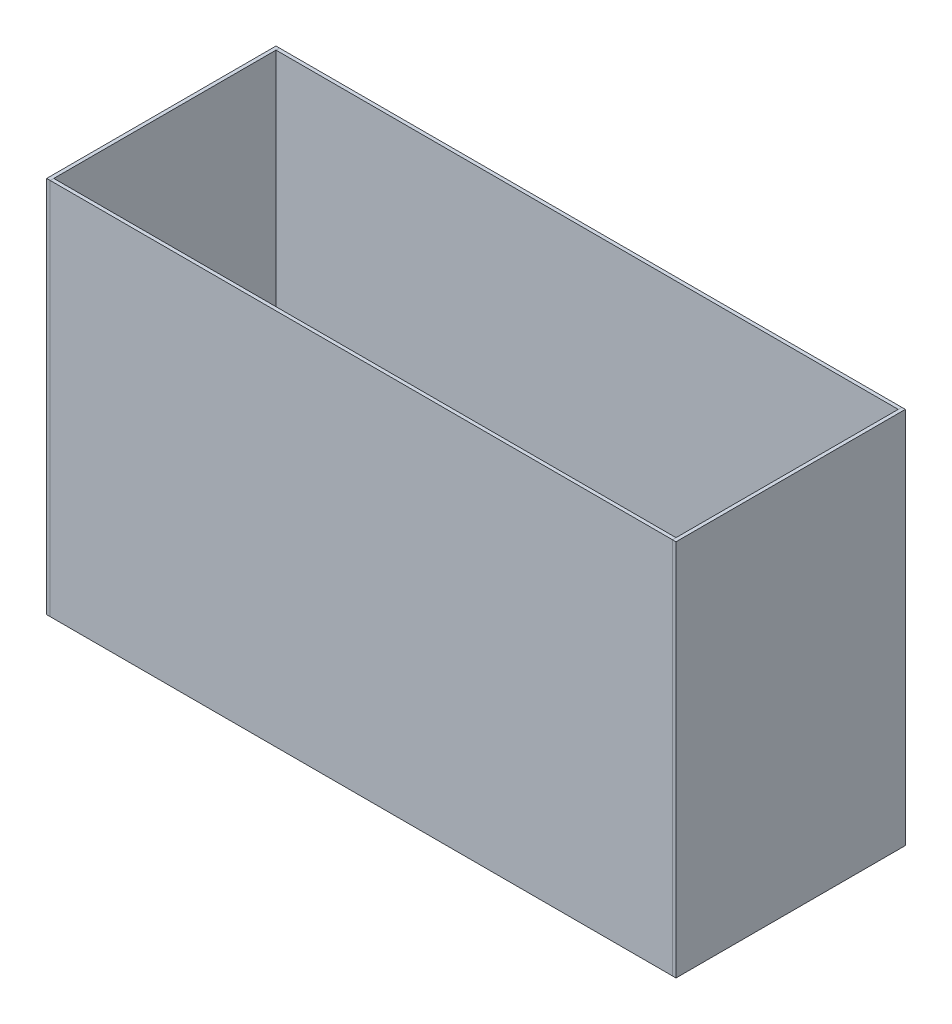
ISO-10303-21;
HEADER;
FILE_DESCRIPTION(('STEP AP214'),'2;1');
FILE_NAME('part.step','',(''),(''),'','','');
FILE_SCHEMA(('AUTOMOTIVE_DESIGN { 1 0 10303 214 1 1 1 1 }'));
ENDSEC;
DATA;
#1=APPLICATION_CONTEXT('core data for automotive mechanical design processes');
#2=APPLICATION_PROTOCOL_DEFINITION('international standard','automotive_design',2000,#1);
#3=PRODUCT_CONTEXT('',#1,'mechanical');
#4=PRODUCT('Part','Part','',(#3));
#5=PRODUCT_RELATED_PRODUCT_CATEGORY('part','',(#4));
#6=PRODUCT_DEFINITION_FORMATION('','',#4);
#7=PRODUCT_DEFINITION_CONTEXT('part definition',#1,'design');
#8=PRODUCT_DEFINITION('design','',#6,#7);
#9=PRODUCT_DEFINITION_SHAPE('','',#8);
#10=(LENGTH_UNIT() NAMED_UNIT(*) SI_UNIT(.MILLI.,.METRE.));
#11=(NAMED_UNIT(*) PLANE_ANGLE_UNIT() SI_UNIT($,.RADIAN.));
#12=(NAMED_UNIT(*) SI_UNIT($,.STERADIAN.) SOLID_ANGLE_UNIT());
#13=UNCERTAINTY_MEASURE_WITH_UNIT(LENGTH_MEASURE(1.E-05),#10,'distance_accuracy_value','');
#14=(GEOMETRIC_REPRESENTATION_CONTEXT(3) GLOBAL_UNCERTAINTY_ASSIGNED_CONTEXT((#13)) GLOBAL_UNIT_ASSIGNED_CONTEXT((#10,
#11,#12)) REPRESENTATION_CONTEXT('',''));
#15=CARTESIAN_POINT('',(0.,0.,0.));
#16=DIRECTION('',(0.,0.,1.));
#17=DIRECTION('',(1.,0.,0.));
#18=AXIS2_PLACEMENT_3D('',#15,#16,#17);
#19=CARTESIAN_POINT('',(1400.,850.,508.));
#20=DIRECTION('',(1.,0.,0.));
#21=DIRECTION('',(0.,0.,-1.));
#22=AXIS2_PLACEMENT_3D('',#19,#20,#21);
#23=PLANE('',#22);
#24=DIRECTION('',(0.,-1.,0.));
#25=VECTOR('',#24,1.);
#26=CARTESIAN_POINT('',(1400.,850.,-8.));
#27=LINE('',#26,#25);
#28=CARTESIAN_POINT('',(1400.,850.,-8.));
#29=VERTEX_POINT('',#28);
#30=CARTESIAN_POINT('',(1400.,0.,-8.));
#31=VERTEX_POINT('',#30);
#32=EDGE_CURVE('E117',#29,#31,#27,.T.);
#33=ORIENTED_EDGE('',*,*,#32,.T.);
#34=DIRECTION('',(0.,0.,-1.));
#35=VECTOR('',#34,1.);
#36=CARTESIAN_POINT('',(1400.,0.,508.));
#37=LINE('',#36,#35);
#38=CARTESIAN_POINT('',(1400.,0.,508.));
#39=VERTEX_POINT('',#38);
#40=EDGE_CURVE('E12',#39,#31,#37,.T.);
#41=ORIENTED_EDGE('',*,*,#40,.F.);
#42=DIRECTION('',(0.,-1.,0.));
#43=VECTOR('',#42,1.);
#44=CARTESIAN_POINT('',(1400.,850.,508.));
#45=LINE('',#44,#43);
#46=CARTESIAN_POINT('',(1400.,850.,508.));
#47=VERTEX_POINT('',#46);
#48=EDGE_CURVE('E105',#47,#39,#45,.T.);
#49=ORIENTED_EDGE('',*,*,#48,.F.);
#50=DIRECTION('',(0.,0.,-1.));
#51=VECTOR('',#50,1.);
#52=CARTESIAN_POINT('',(1400.,850.,508.));
#53=LINE('',#52,#51);
#54=EDGE_CURVE('E113',#47,#29,#53,.T.);
#55=ORIENTED_EDGE('',*,*,#54,.T.);
#56=EDGE_LOOP('',(#33,#41,#49,#55));
#57=FACE_BOUND('',#56,.T.);
#58=ADVANCED_FACE('F54',(#57),#23,.F.);
#59=CARTESIAN_POINT('',(1400.,0.,508.));
#60=DIRECTION('',(0.,1.,0.));
#61=DIRECTION('',(0.,0.,1.));
#62=AXIS2_PLACEMENT_3D('',#59,#60,#61);
#63=PLANE('',#62);
#64=DIRECTION('',(1.,0.,0.));
#65=VECTOR('',#64,1.);
#66=CARTESIAN_POINT('',(1400.,0.,-8.));
#67=LINE('',#66,#65);
#68=CARTESIAN_POINT('',(1408.,0.,-8.));
#69=VERTEX_POINT('',#68);
#70=EDGE_CURVE('E109',#31,#69,#67,.T.);
#71=ORIENTED_EDGE('',*,*,#70,.T.);
#72=DIRECTION('',(0.,0.,-1.));
#73=VECTOR('',#72,1.);
#74=CARTESIAN_POINT('',(1408.,0.,508.));
#75=LINE('',#74,#73);
#76=CARTESIAN_POINT('',(1408.,0.,508.));
#77=VERTEX_POINT('',#76);
#78=EDGE_CURVE('E62',#77,#69,#75,.T.);
#79=ORIENTED_EDGE('',*,*,#78,.F.);
#80=DIRECTION('',(1.,0.,0.));
#81=VECTOR('',#80,1.);
#82=CARTESIAN_POINT('',(1400.,0.,508.));
#83=LINE('',#82,#81);
#84=EDGE_CURVE('E100',#39,#77,#83,.T.);
#85=ORIENTED_EDGE('',*,*,#84,.F.);
#86=ORIENTED_EDGE('',*,*,#40,.T.);
#87=EDGE_LOOP('',(#71,#79,#85,#86));
#88=FACE_BOUND('',#87,.T.);
#89=ADVANCED_FACE('F108',(#88),#63,.F.);
#90=CARTESIAN_POINT('',(1408.,0.,508.));
#91=DIRECTION('',(-1.,0.,0.));
#92=DIRECTION('',(0.,0.,1.));
#93=AXIS2_PLACEMENT_3D('',#90,#91,#92);
#94=PLANE('',#93);
#95=DIRECTION('',(0.,1.,0.));
#96=VECTOR('',#95,1.);
#97=CARTESIAN_POINT('',(1408.,0.,-8.));
#98=LINE('',#97,#96);
#99=CARTESIAN_POINT('',(1408.,850.,-8.));
#100=VERTEX_POINT('',#99);
#101=EDGE_CURVE('E87',#69,#100,#98,.T.);
#102=ORIENTED_EDGE('',*,*,#101,.T.);
#103=DIRECTION('',(0.,0.,-1.));
#104=VECTOR('',#103,1.);
#105=CARTESIAN_POINT('',(1408.,850.,508.));
#106=LINE('',#105,#104);
#107=CARTESIAN_POINT('',(1408.,850.,508.));
#108=VERTEX_POINT('',#107);
#109=EDGE_CURVE('E110',#108,#100,#106,.T.);
#110=ORIENTED_EDGE('',*,*,#109,.F.);
#111=DIRECTION('',(0.,1.,0.));
#112=VECTOR('',#111,1.);
#113=CARTESIAN_POINT('',(1408.,0.,508.));
#114=LINE('',#113,#112);
#115=EDGE_CURVE('E103',#77,#108,#114,.T.);
#116=ORIENTED_EDGE('',*,*,#115,.F.);
#117=ORIENTED_EDGE('',*,*,#78,.T.);
#118=EDGE_LOOP('',(#102,#110,#116,#117));
#119=FACE_BOUND('',#118,.T.);
#120=ADVANCED_FACE('F111',(#119),#94,.F.);
#121=CARTESIAN_POINT('',(1408.,850.,508.));
#122=DIRECTION('',(0.,-1.,0.));
#123=DIRECTION('',(0.,0.,-1.));
#124=AXIS2_PLACEMENT_3D('',#121,#122,#123);
#125=PLANE('',#124);
#126=DIRECTION('',(-1.,0.,0.));
#127=VECTOR('',#126,1.);
#128=CARTESIAN_POINT('',(1408.,850.,-8.));
#129=LINE('',#128,#127);
#130=EDGE_CURVE('E93',#100,#29,#129,.T.);
#131=ORIENTED_EDGE('',*,*,#130,.T.);
#132=ORIENTED_EDGE('',*,*,#54,.F.);
#133=DIRECTION('',(-1.,0.,0.));
#134=VECTOR('',#133,1.);
#135=CARTESIAN_POINT('',(1408.,850.,508.));
#136=LINE('',#135,#134);
#137=EDGE_CURVE('E70',#108,#47,#136,.T.);
#138=ORIENTED_EDGE('',*,*,#137,.F.);
#139=ORIENTED_EDGE('',*,*,#109,.T.);
#140=EDGE_LOOP('',(#131,#132,#138,#139));
#141=FACE_BOUND('',#140,.T.);
#142=ADVANCED_FACE('F124',(#141),#125,.F.);
#143=CARTESIAN_POINT('',(0.,0.,508.));
#144=DIRECTION('',(0.,0.,1.));
#145=DIRECTION('',(1.,0.,0.));
#146=AXIS2_PLACEMENT_3D('',#143,#144,#145);
#147=PLANE('',#146);
#148=ORIENTED_EDGE('',*,*,#48,.T.);
#149=ORIENTED_EDGE('',*,*,#84,.T.);
#150=ORIENTED_EDGE('',*,*,#115,.T.);
#151=ORIENTED_EDGE('',*,*,#137,.T.);
#152=EDGE_LOOP('',(#148,#149,#150,#151));
#153=FACE_BOUND('',#152,.T.);
#154=ADVANCED_FACE('F101',(#153),#147,.T.);
#155=CARTESIAN_POINT('',(0.,0.,-8.));
#156=DIRECTION('',(0.,0.,1.));
#157=DIRECTION('',(1.,0.,0.));
#158=AXIS2_PLACEMENT_3D('',#155,#156,#157);
#159=PLANE('',#158);
#160=ORIENTED_EDGE('',*,*,#32,.F.);
#161=ORIENTED_EDGE('',*,*,#130,.F.);
#162=ORIENTED_EDGE('',*,*,#101,.F.);
#163=ORIENTED_EDGE('',*,*,#70,.F.);
#164=EDGE_LOOP('',(#160,#161,#162,#163));
#165=FACE_BOUND('',#164,.T.);
#166=ADVANCED_FACE('F127',(#165),#159,.F.);
#167=CLOSED_SHELL('',(#58,#89,#120,#142,#154,#166));
#168=MANIFOLD_SOLID_BREP('B2',#167);
#169=CARTESIAN_POINT('',(-8.,850.,508.));
#170=DIRECTION('',(1.,0.,0.));
#171=DIRECTION('',(0.,0.,-1.));
#172=AXIS2_PLACEMENT_3D('',#169,#170,#171);
#173=PLANE('',#172);
#174=DIRECTION('',(0.,-1.,0.));
#175=VECTOR('',#174,1.);
#176=CARTESIAN_POINT('',(-8.,850.,-8.));
#177=LINE('',#176,#175);
#178=CARTESIAN_POINT('',(-8.,850.,-8.));
#179=VERTEX_POINT('',#178);
#180=CARTESIAN_POINT('',(-8.,0.,-8.));
#181=VERTEX_POINT('',#180);
#182=EDGE_CURVE('E251',#179,#181,#177,.T.);
#183=ORIENTED_EDGE('',*,*,#182,.T.);
#184=DIRECTION('',(0.,0.,-1.));
#185=VECTOR('',#184,1.);
#186=CARTESIAN_POINT('',(-8.,0.,508.));
#187=LINE('',#186,#185);
#188=CARTESIAN_POINT('',(-8.,0.,508.));
#189=VERTEX_POINT('',#188);
#190=EDGE_CURVE('E52',#189,#181,#187,.T.);
#191=ORIENTED_EDGE('',*,*,#190,.F.);
#192=DIRECTION('',(0.,-1.,0.));
#193=VECTOR('',#192,1.);
#194=CARTESIAN_POINT('',(-8.,850.,508.));
#195=LINE('',#194,#193);
#196=CARTESIAN_POINT('',(-8.,850.,508.));
#197=VERTEX_POINT('',#196);
#198=EDGE_CURVE('E239',#197,#189,#195,.T.);
#199=ORIENTED_EDGE('',*,*,#198,.F.);
#200=DIRECTION('',(0.,0.,-1.));
#201=VECTOR('',#200,1.);
#202=CARTESIAN_POINT('',(-8.,850.,508.));
#203=LINE('',#202,#201);
#204=EDGE_CURVE('E247',#197,#179,#203,.T.);
#205=ORIENTED_EDGE('',*,*,#204,.T.);
#206=EDGE_LOOP('',(#183,#191,#199,#205));
#207=FACE_BOUND('',#206,.T.);
#208=ADVANCED_FACE('F188',(#207),#173,.F.);
#209=CARTESIAN_POINT('',(-8.,0.,508.));
#210=DIRECTION('',(0.,1.,0.));
#211=DIRECTION('',(0.,0.,1.));
#212=AXIS2_PLACEMENT_3D('',#209,#210,#211);
#213=PLANE('',#212);
#214=DIRECTION('',(1.,0.,0.));
#215=VECTOR('',#214,1.);
#216=CARTESIAN_POINT('',(-8.,0.,-8.));
#217=LINE('',#216,#215);
#218=CARTESIAN_POINT('',(0.,0.,-8.));
#219=VERTEX_POINT('',#218);
#220=EDGE_CURVE('E243',#181,#219,#217,.T.);
#221=ORIENTED_EDGE('',*,*,#220,.T.);
#222=DIRECTION('',(0.,0.,-1.));
#223=VECTOR('',#222,1.);
#224=CARTESIAN_POINT('',(0.,0.,508.));
#225=LINE('',#224,#223);
#226=CARTESIAN_POINT('',(0.,0.,508.));
#227=VERTEX_POINT('',#226);
#228=EDGE_CURVE('E196',#227,#219,#225,.T.);
#229=ORIENTED_EDGE('',*,*,#228,.F.);
#230=DIRECTION('',(1.,0.,0.));
#231=VECTOR('',#230,1.);
#232=CARTESIAN_POINT('',(-8.,0.,508.));
#233=LINE('',#232,#231);
#234=EDGE_CURVE('E234',#189,#227,#233,.T.);
#235=ORIENTED_EDGE('',*,*,#234,.F.);
#236=ORIENTED_EDGE('',*,*,#190,.T.);
#237=EDGE_LOOP('',(#221,#229,#235,#236));
#238=FACE_BOUND('',#237,.T.);
#239=ADVANCED_FACE('F242',(#238),#213,.F.);
#240=CARTESIAN_POINT('',(0.,0.,508.));
#241=DIRECTION('',(-1.,0.,0.));
#242=DIRECTION('',(0.,0.,1.));
#243=AXIS2_PLACEMENT_3D('',#240,#241,#242);
#244=PLANE('',#243);
#245=DIRECTION('',(0.,1.,0.));
#246=VECTOR('',#245,1.);
#247=CARTESIAN_POINT('',(0.,0.,-8.));
#248=LINE('',#247,#246);
#249=CARTESIAN_POINT('',(0.,850.,-8.));
#250=VERTEX_POINT('',#249);
#251=EDGE_CURVE('E221',#219,#250,#248,.T.);
#252=ORIENTED_EDGE('',*,*,#251,.T.);
#253=DIRECTION('',(0.,0.,-1.));
#254=VECTOR('',#253,1.);
#255=CARTESIAN_POINT('',(0.,850.,508.));
#256=LINE('',#255,#254);
#257=CARTESIAN_POINT('',(0.,850.,508.));
#258=VERTEX_POINT('',#257);
#259=EDGE_CURVE('E244',#258,#250,#256,.T.);
#260=ORIENTED_EDGE('',*,*,#259,.F.);
#261=DIRECTION('',(0.,1.,0.));
#262=VECTOR('',#261,1.);
#263=CARTESIAN_POINT('',(0.,0.,508.));
#264=LINE('',#263,#262);
#265=EDGE_CURVE('E237',#227,#258,#264,.T.);
#266=ORIENTED_EDGE('',*,*,#265,.F.);
#267=ORIENTED_EDGE('',*,*,#228,.T.);
#268=EDGE_LOOP('',(#252,#260,#266,#267));
#269=FACE_BOUND('',#268,.T.);
#270=ADVANCED_FACE('F245',(#269),#244,.F.);
#271=CARTESIAN_POINT('',(0.,850.,508.));
#272=DIRECTION('',(0.,-1.,0.));
#273=DIRECTION('',(0.,0.,-1.));
#274=AXIS2_PLACEMENT_3D('',#271,#272,#273);
#275=PLANE('',#274);
#276=DIRECTION('',(-1.,0.,0.));
#277=VECTOR('',#276,1.);
#278=CARTESIAN_POINT('',(0.,850.,-8.));
#279=LINE('',#278,#277);
#280=EDGE_CURVE('E227',#250,#179,#279,.T.);
#281=ORIENTED_EDGE('',*,*,#280,.T.);
#282=ORIENTED_EDGE('',*,*,#204,.F.);
#283=DIRECTION('',(-1.,0.,0.));
#284=VECTOR('',#283,1.);
#285=CARTESIAN_POINT('',(0.,850.,508.));
#286=LINE('',#285,#284);
#287=EDGE_CURVE('E204',#258,#197,#286,.T.);
#288=ORIENTED_EDGE('',*,*,#287,.F.);
#289=ORIENTED_EDGE('',*,*,#259,.T.);
#290=EDGE_LOOP('',(#281,#282,#288,#289));
#291=FACE_BOUND('',#290,.T.);
#292=ADVANCED_FACE('F258',(#291),#275,.F.);
#293=CARTESIAN_POINT('',(0.,0.,508.));
#294=DIRECTION('',(0.,0.,1.));
#295=DIRECTION('',(1.,0.,0.));
#296=AXIS2_PLACEMENT_3D('',#293,#294,#295);
#297=PLANE('',#296);
#298=ORIENTED_EDGE('',*,*,#198,.T.);
#299=ORIENTED_EDGE('',*,*,#234,.T.);
#300=ORIENTED_EDGE('',*,*,#265,.T.);
#301=ORIENTED_EDGE('',*,*,#287,.T.);
#302=EDGE_LOOP('',(#298,#299,#300,#301));
#303=FACE_BOUND('',#302,.T.);
#304=ADVANCED_FACE('F235',(#303),#297,.T.);
#305=CARTESIAN_POINT('',(0.,0.,-8.));
#306=DIRECTION('',(0.,0.,1.));
#307=DIRECTION('',(1.,0.,0.));
#308=AXIS2_PLACEMENT_3D('',#305,#306,#307);
#309=PLANE('',#308);
#310=ORIENTED_EDGE('',*,*,#182,.F.);
#311=ORIENTED_EDGE('',*,*,#280,.F.);
#312=ORIENTED_EDGE('',*,*,#251,.F.);
#313=ORIENTED_EDGE('',*,*,#220,.F.);
#314=EDGE_LOOP('',(#310,#311,#312,#313));
#315=FACE_BOUND('',#314,.T.);
#316=ADVANCED_FACE('F261',(#315),#309,.F.);
#317=CLOSED_SHELL('',(#208,#239,#270,#292,#304,#316));
#318=MANIFOLD_SOLID_BREP('B6',#317);
#319=CARTESIAN_POINT('',(0.,850.,508.));
#320=DIRECTION('',(1.,0.,0.));
#321=DIRECTION('',(0.,0.,-1.));
#322=AXIS2_PLACEMENT_3D('',#319,#320,#321);
#323=PLANE('',#322);
#324=DIRECTION('',(0.,-1.,0.));
#325=VECTOR('',#324,1.);
#326=CARTESIAN_POINT('',(0.,850.,500.));
#327=LINE('',#326,#325);
#328=CARTESIAN_POINT('',(0.,850.,500.));
#329=VERTEX_POINT('',#328);
#330=CARTESIAN_POINT('',(0.,0.,500.));
#331=VERTEX_POINT('',#330);
#332=EDGE_CURVE('E384',#329,#331,#327,.T.);
#333=ORIENTED_EDGE('',*,*,#332,.T.);
#334=DIRECTION('',(0.,0.,-1.));
#335=VECTOR('',#334,1.);
#336=CARTESIAN_POINT('',(0.,0.,508.));
#337=LINE('',#336,#335);
#338=CARTESIAN_POINT('',(0.,0.,508.));
#339=VERTEX_POINT('',#338);
#340=EDGE_CURVE('E186',#339,#331,#337,.T.);
#341=ORIENTED_EDGE('',*,*,#340,.F.);
#342=DIRECTION('',(0.,-1.,0.));
#343=VECTOR('',#342,1.);
#344=CARTESIAN_POINT('',(0.,850.,508.));
#345=LINE('',#344,#343);
#346=CARTESIAN_POINT('',(0.,850.,508.));
#347=VERTEX_POINT('',#346);
#348=EDGE_CURVE('E372',#347,#339,#345,.T.);
#349=ORIENTED_EDGE('',*,*,#348,.F.);
#350=DIRECTION('',(0.,0.,-1.));
#351=VECTOR('',#350,1.);
#352=CARTESIAN_POINT('',(0.,850.,508.));
#353=LINE('',#352,#351);
#354=EDGE_CURVE('E380',#347,#329,#353,.T.);
#355=ORIENTED_EDGE('',*,*,#354,.T.);
#356=EDGE_LOOP('',(#333,#341,#349,#355));
#357=FACE_BOUND('',#356,.T.);
#358=ADVANCED_FACE('F321',(#357),#323,.F.);
#359=CARTESIAN_POINT('',(0.,0.,508.));
#360=DIRECTION('',(0.,1.,0.));
#361=DIRECTION('',(0.,0.,1.));
#362=AXIS2_PLACEMENT_3D('',#359,#360,#361);
#363=PLANE('',#362);
#364=DIRECTION('',(1.,0.,0.));
#365=VECTOR('',#364,1.);
#366=CARTESIAN_POINT('',(0.,0.,500.));
#367=LINE('',#366,#365);
#368=CARTESIAN_POINT('',(1400.,0.,500.));
#369=VERTEX_POINT('',#368);
#370=EDGE_CURVE('E376',#331,#369,#367,.T.);
#371=ORIENTED_EDGE('',*,*,#370,.T.);
#372=DIRECTION('',(0.,0.,-1.));
#373=VECTOR('',#372,1.);
#374=CARTESIAN_POINT('',(1400.,0.,508.));
#375=LINE('',#374,#373);
#376=CARTESIAN_POINT('',(1400.,0.,508.));
#377=VERTEX_POINT('',#376);
#378=EDGE_CURVE('E329',#377,#369,#375,.T.);
#379=ORIENTED_EDGE('',*,*,#378,.F.);
#380=DIRECTION('',(1.,0.,0.));
#381=VECTOR('',#380,1.);
#382=CARTESIAN_POINT('',(0.,0.,508.));
#383=LINE('',#382,#381);
#384=EDGE_CURVE('E367',#339,#377,#383,.T.);
#385=ORIENTED_EDGE('',*,*,#384,.F.);
#386=ORIENTED_EDGE('',*,*,#340,.T.);
#387=EDGE_LOOP('',(#371,#379,#385,#386));
#388=FACE_BOUND('',#387,.T.);
#389=ADVANCED_FACE('F375',(#388),#363,.F.);
#390=CARTESIAN_POINT('',(1400.,0.,508.));
#391=DIRECTION('',(-1.,0.,0.));
#392=DIRECTION('',(0.,0.,1.));
#393=AXIS2_PLACEMENT_3D('',#390,#391,#392);
#394=PLANE('',#393);
#395=DIRECTION('',(0.,1.,0.));
#396=VECTOR('',#395,1.);
#397=CARTESIAN_POINT('',(1400.,0.,500.));
#398=LINE('',#397,#396);
#399=CARTESIAN_POINT('',(1400.,850.,500.));
#400=VERTEX_POINT('',#399);
#401=EDGE_CURVE('E354',#369,#400,#398,.T.);
#402=ORIENTED_EDGE('',*,*,#401,.T.);
#403=DIRECTION('',(0.,0.,-1.));
#404=VECTOR('',#403,1.);
#405=CARTESIAN_POINT('',(1400.,850.,508.));
#406=LINE('',#405,#404);
#407=CARTESIAN_POINT('',(1400.,850.,508.));
#408=VERTEX_POINT('',#407);
#409=EDGE_CURVE('E377',#408,#400,#406,.T.);
#410=ORIENTED_EDGE('',*,*,#409,.F.);
#411=DIRECTION('',(0.,1.,0.));
#412=VECTOR('',#411,1.);
#413=CARTESIAN_POINT('',(1400.,0.,508.));
#414=LINE('',#413,#412);
#415=EDGE_CURVE('E370',#377,#408,#414,.T.);
#416=ORIENTED_EDGE('',*,*,#415,.F.);
#417=ORIENTED_EDGE('',*,*,#378,.T.);
#418=EDGE_LOOP('',(#402,#410,#416,#417));
#419=FACE_BOUND('',#418,.T.);
#420=ADVANCED_FACE('F378',(#419),#394,.F.);
#421=CARTESIAN_POINT('',(1400.,850.,508.));
#422=DIRECTION('',(0.,-1.,0.));
#423=DIRECTION('',(0.,0.,-1.));
#424=AXIS2_PLACEMENT_3D('',#421,#422,#423);
#425=PLANE('',#424);
#426=DIRECTION('',(-1.,0.,0.));
#427=VECTOR('',#426,1.);
#428=CARTESIAN_POINT('',(1400.,850.,500.));
#429=LINE('',#428,#427);
#430=EDGE_CURVE('E360',#400,#329,#429,.T.);
#431=ORIENTED_EDGE('',*,*,#430,.T.);
#432=ORIENTED_EDGE('',*,*,#354,.F.);
#433=DIRECTION('',(-1.,0.,0.));
#434=VECTOR('',#433,1.);
#435=CARTESIAN_POINT('',(1400.,850.,508.));
#436=LINE('',#435,#434);
#437=EDGE_CURVE('E337',#408,#347,#436,.T.);
#438=ORIENTED_EDGE('',*,*,#437,.F.);
#439=ORIENTED_EDGE('',*,*,#409,.T.);
#440=EDGE_LOOP('',(#431,#432,#438,#439));
#441=FACE_BOUND('',#440,.T.);
#442=ADVANCED_FACE('F391',(#441),#425,.F.);
#443=CARTESIAN_POINT('',(0.,0.,508.));
#444=DIRECTION('',(0.,0.,1.));
#445=DIRECTION('',(1.,0.,0.));
#446=AXIS2_PLACEMENT_3D('',#443,#444,#445);
#447=PLANE('',#446);
#448=ORIENTED_EDGE('',*,*,#348,.T.);
#449=ORIENTED_EDGE('',*,*,#384,.T.);
#450=ORIENTED_EDGE('',*,*,#415,.T.);
#451=ORIENTED_EDGE('',*,*,#437,.T.);
#452=EDGE_LOOP('',(#448,#449,#450,#451));
#453=FACE_BOUND('',#452,.T.);
#454=ADVANCED_FACE('F368',(#453),#447,.T.);
#455=CARTESIAN_POINT('',(0.,0.,500.));
#456=DIRECTION('',(0.,0.,1.));
#457=DIRECTION('',(1.,0.,0.));
#458=AXIS2_PLACEMENT_3D('',#455,#456,#457);
#459=PLANE('',#458);
#460=ORIENTED_EDGE('',*,*,#332,.F.);
#461=ORIENTED_EDGE('',*,*,#430,.F.);
#462=ORIENTED_EDGE('',*,*,#401,.F.);
#463=ORIENTED_EDGE('',*,*,#370,.F.);
#464=EDGE_LOOP('',(#460,#461,#462,#463));
#465=FACE_BOUND('',#464,.T.);
#466=ADVANCED_FACE('F394',(#465),#459,.F.);
#467=CLOSED_SHELL('',(#358,#389,#420,#442,#454,#466));
#468=MANIFOLD_SOLID_BREP('B46',#467);
#469=CARTESIAN_POINT('',(0.,850.,0.));
#470=DIRECTION('',(1.,0.,0.));
#471=DIRECTION('',(0.,0.,-1.));
#472=AXIS2_PLACEMENT_3D('',#469,#470,#471);
#473=PLANE('',#472);
#474=DIRECTION('',(0.,-1.,0.));
#475=VECTOR('',#474,1.);
#476=CARTESIAN_POINT('',(0.,850.,-8.));
#477=LINE('',#476,#475);
#478=CARTESIAN_POINT('',(0.,850.,-8.));
#479=VERTEX_POINT('',#478);
#480=CARTESIAN_POINT('',(0.,0.,-8.));
#481=VERTEX_POINT('',#480);
#482=EDGE_CURVE('E508',#479,#481,#477,.T.);
#483=ORIENTED_EDGE('',*,*,#482,.T.);
#484=DIRECTION('',(0.,0.,-1.));
#485=VECTOR('',#484,1.);
#486=CARTESIAN_POINT('',(0.,0.,0.));
#487=LINE('',#486,#485);
#488=CARTESIAN_POINT('',(0.,0.,0.));
#489=VERTEX_POINT('',#488);
#490=EDGE_CURVE('E319',#489,#481,#487,.T.);
#491=ORIENTED_EDGE('',*,*,#490,.F.);
#492=DIRECTION('',(0.,-1.,0.));
#493=VECTOR('',#492,1.);
#494=CARTESIAN_POINT('',(0.,850.,0.));
#495=LINE('',#494,#493);
#496=CARTESIAN_POINT('',(0.,850.,0.));
#497=VERTEX_POINT('',#496);
#498=EDGE_CURVE('E496',#497,#489,#495,.T.);
#499=ORIENTED_EDGE('',*,*,#498,.F.);
#500=DIRECTION('',(0.,0.,-1.));
#501=VECTOR('',#500,1.);
#502=CARTESIAN_POINT('',(0.,850.,0.));
#503=LINE('',#502,#501);
#504=EDGE_CURVE('E504',#497,#479,#503,.T.);
#505=ORIENTED_EDGE('',*,*,#504,.T.);
#506=EDGE_LOOP('',(#483,#491,#499,#505));
#507=FACE_BOUND('',#506,.T.);
#508=ADVANCED_FACE('F445',(#507),#473,.F.);
#509=CARTESIAN_POINT('',(0.,0.,0.));
#510=DIRECTION('',(0.,1.,0.));
#511=DIRECTION('',(0.,0.,1.));
#512=AXIS2_PLACEMENT_3D('',#509,#510,#511);
#513=PLANE('',#512);
#514=DIRECTION('',(1.,0.,0.));
#515=VECTOR('',#514,1.);
#516=CARTESIAN_POINT('',(0.,0.,-8.));
#517=LINE('',#516,#515);
#518=CARTESIAN_POINT('',(1400.,0.,-8.));
#519=VERTEX_POINT('',#518);
#520=EDGE_CURVE('E500',#481,#519,#517,.T.);
#521=ORIENTED_EDGE('',*,*,#520,.T.);
#522=DIRECTION('',(0.,0.,-1.));
#523=VECTOR('',#522,1.);
#524=CARTESIAN_POINT('',(1400.,0.,0.));
#525=LINE('',#524,#523);
#526=CARTESIAN_POINT('',(1400.,0.,0.));
#527=VERTEX_POINT('',#526);
#528=EDGE_CURVE('E453',#527,#519,#525,.T.);
#529=ORIENTED_EDGE('',*,*,#528,.F.);
#530=DIRECTION('',(1.,0.,0.));
#531=VECTOR('',#530,1.);
#532=CARTESIAN_POINT('',(0.,0.,0.));
#533=LINE('',#532,#531);
#534=EDGE_CURVE('E491',#489,#527,#533,.T.);
#535=ORIENTED_EDGE('',*,*,#534,.F.);
#536=ORIENTED_EDGE('',*,*,#490,.T.);
#537=EDGE_LOOP('',(#521,#529,#535,#536));
#538=FACE_BOUND('',#537,.T.);
#539=ADVANCED_FACE('F499',(#538),#513,.F.);
#540=CARTESIAN_POINT('',(1400.,0.,0.));
#541=DIRECTION('',(-1.,0.,0.));
#542=DIRECTION('',(0.,0.,1.));
#543=AXIS2_PLACEMENT_3D('',#540,#541,#542);
#544=PLANE('',#543);
#545=DIRECTION('',(0.,1.,0.));
#546=VECTOR('',#545,1.);
#547=CARTESIAN_POINT('',(1400.,0.,-8.));
#548=LINE('',#547,#546);
#549=CARTESIAN_POINT('',(1400.,850.,-8.));
#550=VERTEX_POINT('',#549);
#551=EDGE_CURVE('E478',#519,#550,#548,.T.);
#552=ORIENTED_EDGE('',*,*,#551,.T.);
#553=DIRECTION('',(0.,0.,-1.));
#554=VECTOR('',#553,1.);
#555=CARTESIAN_POINT('',(1400.,850.,0.));
#556=LINE('',#555,#554);
#557=CARTESIAN_POINT('',(1400.,850.,0.));
#558=VERTEX_POINT('',#557);
#559=EDGE_CURVE('E501',#558,#550,#556,.T.);
#560=ORIENTED_EDGE('',*,*,#559,.F.);
#561=DIRECTION('',(0.,1.,0.));
#562=VECTOR('',#561,1.);
#563=CARTESIAN_POINT('',(1400.,0.,0.));
#564=LINE('',#563,#562);
#565=EDGE_CURVE('E494',#527,#558,#564,.T.);
#566=ORIENTED_EDGE('',*,*,#565,.F.);
#567=ORIENTED_EDGE('',*,*,#528,.T.);
#568=EDGE_LOOP('',(#552,#560,#566,#567));
#569=FACE_BOUND('',#568,.T.);
#570=ADVANCED_FACE('F502',(#569),#544,.F.);
#571=CARTESIAN_POINT('',(1400.,850.,0.));
#572=DIRECTION('',(0.,-1.,0.));
#573=DIRECTION('',(0.,0.,-1.));
#574=AXIS2_PLACEMENT_3D('',#571,#572,#573);
#575=PLANE('',#574);
#576=DIRECTION('',(-1.,0.,0.));
#577=VECTOR('',#576,1.);
#578=CARTESIAN_POINT('',(1400.,850.,-8.));
#579=LINE('',#578,#577);
#580=EDGE_CURVE('E484',#550,#479,#579,.T.);
#581=ORIENTED_EDGE('',*,*,#580,.T.);
#582=ORIENTED_EDGE('',*,*,#504,.F.);
#583=DIRECTION('',(-1.,0.,0.));
#584=VECTOR('',#583,1.);
#585=CARTESIAN_POINT('',(1400.,850.,0.));
#586=LINE('',#585,#584);
#587=EDGE_CURVE('E461',#558,#497,#586,.T.);
#588=ORIENTED_EDGE('',*,*,#587,.F.);
#589=ORIENTED_EDGE('',*,*,#559,.T.);
#590=EDGE_LOOP('',(#581,#582,#588,#589));
#591=FACE_BOUND('',#590,.T.);
#592=ADVANCED_FACE('F515',(#591),#575,.F.);
#593=CARTESIAN_POINT('',(0.,0.,0.));
#594=DIRECTION('',(0.,0.,1.));
#595=DIRECTION('',(1.,0.,0.));
#596=AXIS2_PLACEMENT_3D('',#593,#594,#595);
#597=PLANE('',#596);
#598=ORIENTED_EDGE('',*,*,#498,.T.);
#599=ORIENTED_EDGE('',*,*,#534,.T.);
#600=ORIENTED_EDGE('',*,*,#565,.T.);
#601=ORIENTED_EDGE('',*,*,#587,.T.);
#602=EDGE_LOOP('',(#598,#599,#600,#601));
#603=FACE_BOUND('',#602,.T.);
#604=ADVANCED_FACE('F492',(#603),#597,.T.);
#605=CARTESIAN_POINT('',(0.,0.,-8.));
#606=DIRECTION('',(0.,0.,1.));
#607=DIRECTION('',(1.,0.,0.));
#608=AXIS2_PLACEMENT_3D('',#605,#606,#607);
#609=PLANE('',#608);
#610=ORIENTED_EDGE('',*,*,#482,.F.);
#611=ORIENTED_EDGE('',*,*,#580,.F.);
#612=ORIENTED_EDGE('',*,*,#551,.F.);
#613=ORIENTED_EDGE('',*,*,#520,.F.);
#614=EDGE_LOOP('',(#610,#611,#612,#613));
#615=FACE_BOUND('',#614,.T.);
#616=ADVANCED_FACE('F518',(#615),#609,.F.);
#617=CLOSED_SHELL('',(#508,#539,#570,#592,#604,#616));
#618=MANIFOLD_SOLID_BREP('B180',#617);
#619=ADVANCED_BREP_SHAPE_REPRESENTATION('',(#18,#168,#318,#468,#618),#14);
#620=SHAPE_DEFINITION_REPRESENTATION(#9,#619);
ENDSEC;
END-ISO-10303-21;
